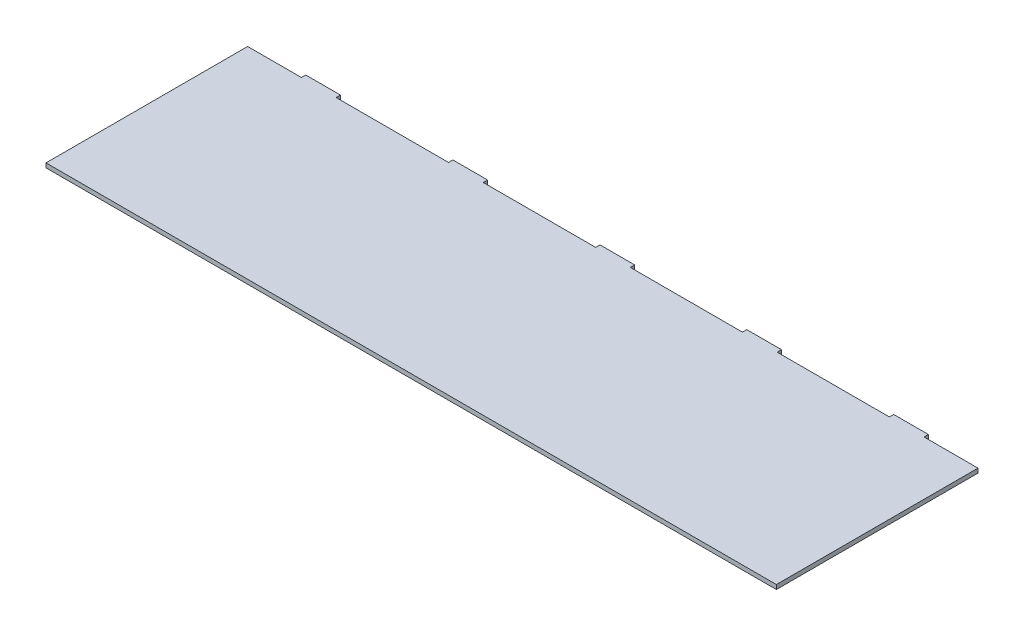
ISO-10303-21;
HEADER;
FILE_DESCRIPTION(('STEP AP214'),'2;1');
FILE_NAME('part.step','',(''),(''),'','','');
FILE_SCHEMA(('AUTOMOTIVE_DESIGN { 1 0 10303 214 1 1 1 1 }'));
ENDSEC;
DATA;
#1=APPLICATION_CONTEXT('core data for automotive mechanical design processes');
#2=APPLICATION_PROTOCOL_DEFINITION('international standard','automotive_design',2000,#1);
#3=PRODUCT_CONTEXT('',#1,'mechanical');
#4=PRODUCT('Part','Part','',(#3));
#5=PRODUCT_RELATED_PRODUCT_CATEGORY('part','',(#4));
#6=PRODUCT_DEFINITION_FORMATION('','',#4);
#7=PRODUCT_DEFINITION_CONTEXT('part definition',#1,'design');
#8=PRODUCT_DEFINITION('design','',#6,#7);
#9=PRODUCT_DEFINITION_SHAPE('','',#8);
#10=(LENGTH_UNIT() NAMED_UNIT(*) SI_UNIT(.MILLI.,.METRE.));
#11=(NAMED_UNIT(*) PLANE_ANGLE_UNIT() SI_UNIT($,.RADIAN.));
#12=(NAMED_UNIT(*) SI_UNIT($,.STERADIAN.) SOLID_ANGLE_UNIT());
#13=UNCERTAINTY_MEASURE_WITH_UNIT(LENGTH_MEASURE(1.E-05),#10,'distance_accuracy_value','');
#14=(GEOMETRIC_REPRESENTATION_CONTEXT(3) GLOBAL_UNCERTAINTY_ASSIGNED_CONTEXT((#13)) GLOBAL_UNIT_ASSIGNED_CONTEXT((#10,
#11,#12)) REPRESENTATION_CONTEXT('',''));
#15=CARTESIAN_POINT('',(0.,0.,0.));
#16=DIRECTION('',(0.,0.,1.));
#17=DIRECTION('',(1.,0.,0.));
#18=AXIS2_PLACEMENT_3D('',#15,#16,#17);
#19=CARTESIAN_POINT('',(0.,3.175,-147.69846));
#20=DIRECTION('',(0.,0.,1.));
#21=DIRECTION('',(1.,0.,0.));
#22=AXIS2_PLACEMENT_3D('',#19,#20,#21);
#23=PLANE('',#22);
#24=DIRECTION('',(0.,1.,0.));
#25=VECTOR('',#24,1.);
#26=CARTESIAN_POINT('',(39.398109833325,1.66533453693773E-12,-147.69846));
#27=LINE('',#26,#25);
#28=CARTESIAN_POINT('',(39.398109833325,1.66533453693773E-12,-147.69846));
#29=VERTEX_POINT('',#28);
#30=CARTESIAN_POINT('',(39.398109833325,3.175,-147.69846));
#31=VERTEX_POINT('',#30);
#32=EDGE_CURVE('E385',#29,#31,#27,.T.);
#33=ORIENTED_EDGE('',*,*,#32,.F.);
#34=DIRECTION('',(-1.,0.,0.));
#35=VECTOR('',#34,1.);
#36=CARTESIAN_POINT('',(0.,0.,-147.69846));
#37=LINE('',#36,#35);
#38=CARTESIAN_POINT('',(0.,0.,-147.69846));
#39=VERTEX_POINT('',#38);
#40=EDGE_CURVE('E220',#29,#39,#37,.T.);
#41=ORIENTED_EDGE('',*,*,#40,.T.);
#42=DIRECTION('',(0.,-1.,0.));
#43=VECTOR('',#42,1.);
#44=CARTESIAN_POINT('',(0.,3.175,-147.69846));
#45=LINE('',#44,#43);
#46=CARTESIAN_POINT('',(0.,3.175,-147.69846));
#47=VERTEX_POINT('',#46);
#48=EDGE_CURVE('E346',#47,#39,#45,.T.);
#49=ORIENTED_EDGE('',*,*,#48,.F.);
#50=DIRECTION('',(-1.,0.,0.));
#51=VECTOR('',#50,1.);
#52=CARTESIAN_POINT('',(0.,3.175,-147.69846));
#53=LINE('',#52,#51);
#54=EDGE_CURVE('E51',#31,#47,#53,.T.);
#55=ORIENTED_EDGE('',*,*,#54,.F.);
#56=EDGE_LOOP('',(#33,#41,#49,#55));
#57=FACE_BOUND('',#56,.T.);
#58=ADVANCED_FACE('F36',(#57),#23,.F.);
#59=DIRECTION('',(0.,-1.,0.));
#60=VECTOR('',#59,1.);
#61=CARTESIAN_POINT('',(64.798109833325,1.66533453693773E-12,-147.69846));
#62=LINE('',#61,#60);
#63=CARTESIAN_POINT('',(64.798109833325,3.175,-147.69846));
#64=VERTEX_POINT('',#63);
#65=CARTESIAN_POINT('',(64.798109833325,0.,-147.69846));
#66=VERTEX_POINT('',#65);
#67=EDGE_CURVE('E59',#64,#66,#62,.T.);
#68=ORIENTED_EDGE('',*,*,#67,.F.);
#69=CARTESIAN_POINT('',(147.188954487785,3.175,-147.69846));
#70=VERTEX_POINT('',#69);
#71=EDGE_CURVE('E416',#70,#64,#53,.T.);
#72=ORIENTED_EDGE('',*,*,#71,.F.);
#73=DIRECTION('',(0.,1.,0.));
#74=VECTOR('',#73,1.);
#75=CARTESIAN_POINT('',(147.188954487785,1.27675647831893E-12,-147.69846));
#76=LINE('',#75,#74);
#77=CARTESIAN_POINT('',(147.188954487785,1.27675647831893E-12,-147.69846));
#78=VERTEX_POINT('',#77);
#79=EDGE_CURVE('E221',#78,#70,#76,.T.);
#80=ORIENTED_EDGE('',*,*,#79,.F.);
#81=EDGE_CURVE('E386',#78,#66,#37,.T.);
#82=ORIENTED_EDGE('',*,*,#81,.T.);
#83=EDGE_LOOP('',(#68,#72,#80,#82));
#84=FACE_BOUND('',#83,.T.);
#85=ADVANCED_FACE('F430',(#84),#23,.F.);
#86=DIRECTION('',(0.,-1.,0.));
#87=VECTOR('',#86,1.);
#88=CARTESIAN_POINT('',(172.588954487785,1.27675647831893E-12,-147.69846));
#89=LINE('',#88,#87);
#90=CARTESIAN_POINT('',(172.588954487785,3.175,-147.69846));
#91=VERTEX_POINT('',#90);
#92=CARTESIAN_POINT('',(172.588954487785,0.,-147.69846));
#93=VERTEX_POINT('',#92);
#94=EDGE_CURVE('E224',#91,#93,#89,.T.);
#95=ORIENTED_EDGE('',*,*,#94,.F.);
#96=CARTESIAN_POINT('',(254.965260383511,3.175,-147.69846));
#97=VERTEX_POINT('',#96);
#98=EDGE_CURVE('E413',#97,#91,#53,.T.);
#99=ORIENTED_EDGE('',*,*,#98,.F.);
#100=DIRECTION('',(0.,1.,0.));
#101=VECTOR('',#100,1.);
#102=CARTESIAN_POINT('',(254.965260383511,6.66133814775094E-13,-147.69846));
#103=LINE('',#102,#101);
#104=CARTESIAN_POINT('',(254.965260383511,6.66133814775094E-13,-147.69846));
#105=VERTEX_POINT('',#104);
#106=EDGE_CURVE('E253',#105,#97,#103,.T.);
#107=ORIENTED_EDGE('',*,*,#106,.F.);
#108=EDGE_CURVE('E387',#105,#93,#37,.T.);
#109=ORIENTED_EDGE('',*,*,#108,.T.);
#110=EDGE_LOOP('',(#95,#99,#107,#109));
#111=FACE_BOUND('',#110,.T.);
#112=ADVANCED_FACE('F442',(#111),#23,.F.);
#113=DIRECTION('',(0.,-1.,0.));
#114=VECTOR('',#113,1.);
#115=CARTESIAN_POINT('',(280.365260383511,6.66133814775094E-13,-147.69846));
#116=LINE('',#115,#114);
#117=CARTESIAN_POINT('',(280.365260383511,3.175,-147.69846));
#118=VERTEX_POINT('',#117);
#119=CARTESIAN_POINT('',(280.365260383511,0.,-147.69846));
#120=VERTEX_POINT('',#119);
#121=EDGE_CURVE('E258',#118,#120,#116,.T.);
#122=ORIENTED_EDGE('',*,*,#121,.F.);
#123=CARTESIAN_POINT('',(362.444029999994,3.175,-147.69846));
#124=VERTEX_POINT('',#123);
#125=EDGE_CURVE('E411',#124,#118,#53,.T.);
#126=ORIENTED_EDGE('',*,*,#125,.F.);
#127=DIRECTION('',(0.,1.,0.));
#128=VECTOR('',#127,1.);
#129=CARTESIAN_POINT('',(362.444029999994,3.88578058618805E-13,-147.69846));
#130=LINE('',#129,#128);
#131=CARTESIAN_POINT('',(362.444029999994,3.88578058618805E-13,-147.69846));
#132=VERTEX_POINT('',#131);
#133=EDGE_CURVE('E280',#132,#124,#130,.T.);
#134=ORIENTED_EDGE('',*,*,#133,.F.);
#135=EDGE_CURVE('E389',#132,#120,#37,.T.);
#136=ORIENTED_EDGE('',*,*,#135,.T.);
#137=EDGE_LOOP('',(#122,#126,#134,#136));
#138=FACE_BOUND('',#137,.T.);
#139=ADVANCED_FACE('F454',(#138),#23,.F.);
#140=DIRECTION('',(0.,-1.,0.));
#141=VECTOR('',#140,1.);
#142=CARTESIAN_POINT('',(387.844029999994,3.88578058618805E-13,-147.69846));
#143=LINE('',#142,#141);
#144=CARTESIAN_POINT('',(387.844029999994,3.175,-147.69846));
#145=VERTEX_POINT('',#144);
#146=CARTESIAN_POINT('',(387.844029999994,0.,-147.69846));
#147=VERTEX_POINT('',#146);
#148=EDGE_CURVE('E285',#145,#147,#143,.T.);
#149=ORIENTED_EDGE('',*,*,#148,.F.);
#150=CARTESIAN_POINT('',(470.071449999994,3.17500000000043,-147.69846));
#151=VERTEX_POINT('',#150);
#152=EDGE_CURVE('E347',#151,#145,#53,.T.);
#153=ORIENTED_EDGE('',*,*,#152,.F.);
#154=DIRECTION('',(0.,1.,0.));
#155=VECTOR('',#154,1.);
#156=CARTESIAN_POINT('',(470.071449999994,0.,-147.69846));
#157=LINE('',#156,#155);
#158=CARTESIAN_POINT('',(470.071449999994,0.,-147.69846));
#159=VERTEX_POINT('',#158);
#160=EDGE_CURVE('E307',#159,#151,#157,.T.);
#161=ORIENTED_EDGE('',*,*,#160,.F.);
#162=EDGE_CURVE('E355',#159,#147,#37,.T.);
#163=ORIENTED_EDGE('',*,*,#162,.T.);
#164=EDGE_LOOP('',(#149,#153,#161,#163));
#165=FACE_BOUND('',#164,.T.);
#166=ADVANCED_FACE('F396',(#165),#23,.F.);
#167=DIRECTION('',(0.,-1.,0.));
#168=VECTOR('',#167,1.);
#169=CARTESIAN_POINT('',(495.471449999994,0.,-147.69846));
#170=LINE('',#169,#168);
#171=CARTESIAN_POINT('',(495.471449999994,3.175,-147.69846));
#172=VERTEX_POINT('',#171);
#173=CARTESIAN_POINT('',(495.471449999994,0.,-147.69846));
#174=VERTEX_POINT('',#173);
#175=EDGE_CURVE('E312',#172,#174,#170,.T.);
#176=ORIENTED_EDGE('',*,*,#175,.F.);
#177=CARTESIAN_POINT('',(534.99766,3.175,-147.69846));
#178=VERTEX_POINT('',#177);
#179=EDGE_CURVE('E343',#178,#172,#53,.T.);
#180=ORIENTED_EDGE('',*,*,#179,.F.);
#181=DIRECTION('',(0.,-1.,0.));
#182=VECTOR('',#181,1.);
#183=CARTESIAN_POINT('',(534.99766,3.175,-147.69846));
#184=LINE('',#183,#182);
#185=CARTESIAN_POINT('',(534.99766,0.,-147.69846));
#186=VERTEX_POINT('',#185);
#187=EDGE_CURVE('E358',#178,#186,#184,.T.);
#188=ORIENTED_EDGE('',*,*,#187,.T.);
#189=EDGE_CURVE('E339',#186,#174,#37,.T.);
#190=ORIENTED_EDGE('',*,*,#189,.T.);
#191=EDGE_LOOP('',(#176,#180,#188,#190));
#192=FACE_BOUND('',#191,.T.);
#193=ADVANCED_FACE('F372',(#192),#23,.F.);
#194=CARTESIAN_POINT('',(0.,3.175,0.));
#195=DIRECTION('',(1.,0.,0.));
#196=DIRECTION('',(0.,0.,-1.));
#197=AXIS2_PLACEMENT_3D('',#194,#195,#196);
#198=PLANE('',#197);
#199=DIRECTION('',(0.,0.,1.));
#200=VECTOR('',#199,1.);
#201=CARTESIAN_POINT('',(0.,0.,0.));
#202=LINE('',#201,#200);
#203=CARTESIAN_POINT('',(0.,0.,0.));
#204=VERTEX_POINT('',#203);
#205=EDGE_CURVE('E334',#39,#204,#202,.T.);
#206=ORIENTED_EDGE('',*,*,#205,.T.);
#207=DIRECTION('',(0.,-1.,0.));
#208=VECTOR('',#207,1.);
#209=CARTESIAN_POINT('',(0.,3.175,0.));
#210=LINE('',#209,#208);
#211=CARTESIAN_POINT('',(0.,3.175,0.));
#212=VERTEX_POINT('',#211);
#213=EDGE_CURVE('E11',#212,#204,#210,.T.);
#214=ORIENTED_EDGE('',*,*,#213,.F.);
#215=DIRECTION('',(0.,0.,1.));
#216=VECTOR('',#215,1.);
#217=CARTESIAN_POINT('',(0.,3.175,0.));
#218=LINE('',#217,#216);
#219=EDGE_CURVE('E335',#47,#212,#218,.T.);
#220=ORIENTED_EDGE('',*,*,#219,.F.);
#221=ORIENTED_EDGE('',*,*,#48,.T.);
#222=EDGE_LOOP('',(#206,#214,#220,#221));
#223=FACE_BOUND('',#222,.T.);
#224=ADVANCED_FACE('F38',(#223),#198,.F.);
#225=CARTESIAN_POINT('',(0.,3.175,0.));
#226=DIRECTION('',(0.,0.,-1.));
#227=DIRECTION('',(-1.,0.,0.));
#228=AXIS2_PLACEMENT_3D('',#225,#226,#227);
#229=PLANE('',#228);
#230=DIRECTION('',(1.,0.,0.));
#231=VECTOR('',#230,1.);
#232=CARTESIAN_POINT('',(0.,0.,0.));
#233=LINE('',#232,#231);
#234=CARTESIAN_POINT('',(534.99766,0.,0.));
#235=VERTEX_POINT('',#234);
#236=EDGE_CURVE('E350',#204,#235,#233,.T.);
#237=ORIENTED_EDGE('',*,*,#236,.T.);
#238=DIRECTION('',(0.,-1.,0.));
#239=VECTOR('',#238,1.);
#240=CARTESIAN_POINT('',(534.99766,3.175,0.));
#241=LINE('',#240,#239);
#242=CARTESIAN_POINT('',(534.99766,3.175,0.));
#243=VERTEX_POINT('',#242);
#244=EDGE_CURVE('E44',#243,#235,#241,.T.);
#245=ORIENTED_EDGE('',*,*,#244,.F.);
#246=DIRECTION('',(1.,0.,0.));
#247=VECTOR('',#246,1.);
#248=CARTESIAN_POINT('',(0.,3.175,0.));
#249=LINE('',#248,#247);
#250=EDGE_CURVE('E338',#212,#243,#249,.T.);
#251=ORIENTED_EDGE('',*,*,#250,.F.);
#252=ORIENTED_EDGE('',*,*,#213,.T.);
#253=EDGE_LOOP('',(#237,#245,#251,#252));
#254=FACE_BOUND('',#253,.T.);
#255=ADVANCED_FACE('F383',(#254),#229,.F.);
#256=CARTESIAN_POINT('',(534.99766,3.175,0.));
#257=DIRECTION('',(-1.,0.,0.));
#258=DIRECTION('',(0.,0.,1.));
#259=AXIS2_PLACEMENT_3D('',#256,#257,#258);
#260=PLANE('',#259);
#261=DIRECTION('',(0.,0.,-1.));
#262=VECTOR('',#261,1.);
#263=CARTESIAN_POINT('',(534.99766,0.,0.));
#264=LINE('',#263,#262);
#265=EDGE_CURVE('E352',#235,#186,#264,.T.);
#266=ORIENTED_EDGE('',*,*,#265,.T.);
#267=ORIENTED_EDGE('',*,*,#187,.F.);
#268=DIRECTION('',(0.,0.,-1.));
#269=VECTOR('',#268,1.);
#270=CARTESIAN_POINT('',(534.99766,3.175,0.));
#271=LINE('',#270,#269);
#272=EDGE_CURVE('E341',#243,#178,#271,.T.);
#273=ORIENTED_EDGE('',*,*,#272,.F.);
#274=ORIENTED_EDGE('',*,*,#244,.T.);
#275=EDGE_LOOP('',(#266,#267,#273,#274));
#276=FACE_BOUND('',#275,.T.);
#277=ADVANCED_FACE('F365',(#276),#260,.F.);
#278=CARTESIAN_POINT('',(0.,3.175,0.));
#279=DIRECTION('',(0.,-1.,0.));
#280=DIRECTION('',(0.,0.,-1.));
#281=AXIS2_PLACEMENT_3D('',#278,#279,#280);
#282=PLANE('',#281);
#283=ORIENTED_EDGE('',*,*,#219,.T.);
#284=ORIENTED_EDGE('',*,*,#250,.T.);
#285=ORIENTED_EDGE('',*,*,#272,.T.);
#286=ORIENTED_EDGE('',*,*,#179,.T.);
#287=DIRECTION('',(0.,0.,1.));
#288=VECTOR('',#287,1.);
#289=CARTESIAN_POINT('',(495.471449999994,3.17500000000043,-150.87346));
#290=LINE('',#289,#288);
#291=CARTESIAN_POINT('',(495.471449999994,3.17500000000043,-150.87346));
#292=VERTEX_POINT('',#291);
#293=EDGE_CURVE('E325',#292,#172,#290,.T.);
#294=ORIENTED_EDGE('',*,*,#293,.F.);
#295=DIRECTION('',(1.,0.,0.));
#296=VECTOR('',#295,1.);
#297=CARTESIAN_POINT('',(495.471449999994,3.17500000000043,-150.87346));
#298=LINE('',#297,#296);
#299=CARTESIAN_POINT('',(470.071449999994,3.17500000000043,-150.87346));
#300=VERTEX_POINT('',#299);
#301=EDGE_CURVE('E314',#300,#292,#298,.T.);
#302=ORIENTED_EDGE('',*,*,#301,.F.);
#303=DIRECTION('',(0.,0.,1.));
#304=VECTOR('',#303,1.);
#305=CARTESIAN_POINT('',(470.071449999994,3.17500000000043,-150.87346));
#306=LINE('',#305,#304);
#307=EDGE_CURVE('E328',#300,#151,#306,.T.);
#308=ORIENTED_EDGE('',*,*,#307,.T.);
#309=ORIENTED_EDGE('',*,*,#152,.T.);
#310=DIRECTION('',(0.,0.,1.));
#311=VECTOR('',#310,1.);
#312=CARTESIAN_POINT('',(387.844029999994,3.17500000000087,-150.87346));
#313=LINE('',#312,#311);
#314=CARTESIAN_POINT('',(387.844029999994,3.17500000000087,-150.87346));
#315=VERTEX_POINT('',#314);
#316=EDGE_CURVE('E298',#315,#145,#313,.T.);
#317=ORIENTED_EDGE('',*,*,#316,.F.);
#318=DIRECTION('',(1.,0.,0.));
#319=VECTOR('',#318,1.);
#320=CARTESIAN_POINT('',(387.844029999994,3.17500000000087,-150.87346));
#321=LINE('',#320,#319);
#322=CARTESIAN_POINT('',(362.444029999994,3.17500000000087,-150.87346));
#323=VERTEX_POINT('',#322);
#324=EDGE_CURVE('E287',#323,#315,#321,.T.);
#325=ORIENTED_EDGE('',*,*,#324,.F.);
#326=DIRECTION('',(0.,0.,1.));
#327=VECTOR('',#326,1.);
#328=CARTESIAN_POINT('',(362.444029999994,3.17500000000087,-150.87346));
#329=LINE('',#328,#327);
#330=EDGE_CURVE('E301',#323,#124,#329,.T.);
#331=ORIENTED_EDGE('',*,*,#330,.T.);
#332=ORIENTED_EDGE('',*,*,#125,.T.);
#333=DIRECTION('',(0.,0.,1.));
#334=VECTOR('',#333,1.);
#335=CARTESIAN_POINT('',(280.365260383511,3.17500000000115,-150.87346));
#336=LINE('',#335,#334);
#337=CARTESIAN_POINT('',(280.365260383511,3.17500000000115,-150.87346));
#338=VERTEX_POINT('',#337);
#339=EDGE_CURVE('E271',#338,#118,#336,.T.);
#340=ORIENTED_EDGE('',*,*,#339,.F.);
#341=DIRECTION('',(1.,0.,0.));
#342=VECTOR('',#341,1.);
#343=CARTESIAN_POINT('',(280.365260383511,3.17500000000115,-150.87346));
#344=LINE('',#343,#342);
#345=CARTESIAN_POINT('',(254.965260383511,3.17500000000115,-150.87346));
#346=VERTEX_POINT('',#345);
#347=EDGE_CURVE('E260',#346,#338,#344,.T.);
#348=ORIENTED_EDGE('',*,*,#347,.F.);
#349=DIRECTION('',(0.,0.,1.));
#350=VECTOR('',#349,1.);
#351=CARTESIAN_POINT('',(254.965260383511,3.17500000000115,-150.87346));
#352=LINE('',#351,#350);
#353=EDGE_CURVE('E274',#346,#97,#352,.T.);
#354=ORIENTED_EDGE('',*,*,#353,.T.);
#355=ORIENTED_EDGE('',*,*,#98,.T.);
#356=DIRECTION('',(0.,0.,1.));
#357=VECTOR('',#356,1.);
#358=CARTESIAN_POINT('',(172.588954487785,3.17500000000132,-150.87346));
#359=LINE('',#358,#357);
#360=CARTESIAN_POINT('',(172.588954487785,3.17500000000132,-150.87346));
#361=VERTEX_POINT('',#360);
#362=EDGE_CURVE('E244',#361,#91,#359,.T.);
#363=ORIENTED_EDGE('',*,*,#362,.F.);
#364=DIRECTION('',(1.,0.,0.));
#365=VECTOR('',#364,1.);
#366=CARTESIAN_POINT('',(172.588954487785,3.17500000000132,-150.87346));
#367=LINE('',#366,#365);
#368=CARTESIAN_POINT('',(147.188954487785,3.17500000000132,-150.87346));
#369=VERTEX_POINT('',#368);
#370=EDGE_CURVE('E235',#369,#361,#367,.T.);
#371=ORIENTED_EDGE('',*,*,#370,.F.);
#372=DIRECTION('',(0.,0.,1.));
#373=VECTOR('',#372,1.);
#374=CARTESIAN_POINT('',(147.188954487785,3.17500000000132,-150.87346));
#375=LINE('',#374,#373);
#376=EDGE_CURVE('E247',#369,#70,#375,.T.);
#377=ORIENTED_EDGE('',*,*,#376,.T.);
#378=ORIENTED_EDGE('',*,*,#71,.T.);
#379=DIRECTION('',(0.,0.,1.));
#380=VECTOR('',#379,1.);
#381=CARTESIAN_POINT('',(64.798109833325,3.1750000000017,-150.87346));
#382=LINE('',#381,#380);
#383=CARTESIAN_POINT('',(64.798109833325,3.1750000000017,-150.87346));
#384=VERTEX_POINT('',#383);
#385=EDGE_CURVE('E226',#384,#64,#382,.T.);
#386=ORIENTED_EDGE('',*,*,#385,.F.);
#387=DIRECTION('',(1.,0.,0.));
#388=VECTOR('',#387,1.);
#389=CARTESIAN_POINT('',(64.798109833325,3.1750000000017,-150.87346));
#390=LINE('',#389,#388);
#391=CARTESIAN_POINT('',(39.398109833325,3.1750000000017,-150.87346));
#392=VERTEX_POINT('',#391);
#393=EDGE_CURVE('E207',#392,#384,#390,.T.);
#394=ORIENTED_EDGE('',*,*,#393,.F.);
#395=DIRECTION('',(0.,0.,1.));
#396=VECTOR('',#395,1.);
#397=CARTESIAN_POINT('',(39.398109833325,3.1750000000017,-150.87346));
#398=LINE('',#397,#396);
#399=EDGE_CURVE('E204',#392,#31,#398,.T.);
#400=ORIENTED_EDGE('',*,*,#399,.T.);
#401=ORIENTED_EDGE('',*,*,#54,.T.);
#402=EDGE_LOOP('',(#283,#284,#285,#286,#294,#302,#308,#309,#317,#325,#331,#332,#340,#348,#354,
#355,#363,#371,#377,#378,#386,#394,#400,#401));
#403=FACE_BOUND('',#402,.T.);
#404=ADVANCED_FACE('F380',(#403),#282,.F.);
#405=CARTESIAN_POINT('',(0.,0.,0.));
#406=DIRECTION('',(0.,-1.,0.));
#407=DIRECTION('',(0.,0.,-1.));
#408=AXIS2_PLACEMENT_3D('',#405,#406,#407);
#409=PLANE('',#408);
#410=ORIENTED_EDGE('',*,*,#205,.F.);
#411=ORIENTED_EDGE('',*,*,#40,.F.);
#412=DIRECTION('',(0.,0.,1.));
#413=VECTOR('',#412,1.);
#414=CARTESIAN_POINT('',(39.398109833325,1.66533453693773E-12,-150.87346));
#415=LINE('',#414,#413);
#416=CARTESIAN_POINT('',(39.398109833325,1.66533453693773E-12,-150.87346));
#417=VERTEX_POINT('',#416);
#418=EDGE_CURVE('E202',#417,#29,#415,.T.);
#419=ORIENTED_EDGE('',*,*,#418,.F.);
#420=DIRECTION('',(-1.,0.,0.));
#421=VECTOR('',#420,1.);
#422=CARTESIAN_POINT('',(64.798109833325,1.66533453693773E-12,-150.87346));
#423=LINE('',#422,#421);
#424=CARTESIAN_POINT('',(64.798109833325,1.66533453693773E-12,-150.87346));
#425=VERTEX_POINT('',#424);
#426=EDGE_CURVE('E208',#425,#417,#423,.T.);
#427=ORIENTED_EDGE('',*,*,#426,.F.);
#428=DIRECTION('',(0.,0.,1.));
#429=VECTOR('',#428,1.);
#430=CARTESIAN_POINT('',(64.798109833325,1.66533453693773E-12,-150.87346));
#431=LINE('',#430,#429);
#432=EDGE_CURVE('E421',#425,#66,#431,.T.);
#433=ORIENTED_EDGE('',*,*,#432,.T.);
#434=ORIENTED_EDGE('',*,*,#81,.F.);
#435=DIRECTION('',(0.,0.,1.));
#436=VECTOR('',#435,1.);
#437=CARTESIAN_POINT('',(147.188954487785,1.27675647831893E-12,-150.87346));
#438=LINE('',#437,#436);
#439=CARTESIAN_POINT('',(147.188954487785,1.27675647831893E-12,-150.87346));
#440=VERTEX_POINT('',#439);
#441=EDGE_CURVE('E250',#440,#78,#438,.T.);
#442=ORIENTED_EDGE('',*,*,#441,.F.);
#443=DIRECTION('',(-1.,0.,0.));
#444=VECTOR('',#443,1.);
#445=CARTESIAN_POINT('',(172.588954487785,1.27675647831893E-12,-150.87346));
#446=LINE('',#445,#444);
#447=CARTESIAN_POINT('',(172.588954487785,1.27675647831893E-12,-150.87346));
#448=VERTEX_POINT('',#447);
#449=EDGE_CURVE('E230',#448,#440,#446,.T.);
#450=ORIENTED_EDGE('',*,*,#449,.F.);
#451=DIRECTION('',(0.,0.,1.));
#452=VECTOR('',#451,1.);
#453=CARTESIAN_POINT('',(172.588954487785,1.27675647831893E-12,-150.87346));
#454=LINE('',#453,#452);
#455=EDGE_CURVE('E238',#448,#93,#454,.T.);
#456=ORIENTED_EDGE('',*,*,#455,.T.);
#457=ORIENTED_EDGE('',*,*,#108,.F.);
#458=DIRECTION('',(0.,0.,1.));
#459=VECTOR('',#458,1.);
#460=CARTESIAN_POINT('',(254.965260383511,6.66133814775094E-13,-150.87346));
#461=LINE('',#460,#459);
#462=CARTESIAN_POINT('',(254.965260383511,6.66133814775094E-13,-150.87346));
#463=VERTEX_POINT('',#462);
#464=EDGE_CURVE('E277',#463,#105,#461,.T.);
#465=ORIENTED_EDGE('',*,*,#464,.F.);
#466=DIRECTION('',(-1.,0.,0.));
#467=VECTOR('',#466,1.);
#468=CARTESIAN_POINT('',(280.365260383511,6.66133814775094E-13,-150.87346));
#469=LINE('',#468,#467);
#470=CARTESIAN_POINT('',(280.365260383511,6.66133814775094E-13,-150.87346));
#471=VERTEX_POINT('',#470);
#472=EDGE_CURVE('E254',#471,#463,#469,.T.);
#473=ORIENTED_EDGE('',*,*,#472,.F.);
#474=DIRECTION('',(0.,0.,1.));
#475=VECTOR('',#474,1.);
#476=CARTESIAN_POINT('',(280.365260383511,6.66133814775094E-13,-150.87346));
#477=LINE('',#476,#475);
#478=EDGE_CURVE('E264',#471,#120,#477,.T.);
#479=ORIENTED_EDGE('',*,*,#478,.T.);
#480=ORIENTED_EDGE('',*,*,#135,.F.);
#481=DIRECTION('',(0.,0.,1.));
#482=VECTOR('',#481,1.);
#483=CARTESIAN_POINT('',(362.444029999994,3.88578058618805E-13,-150.87346));
#484=LINE('',#483,#482);
#485=CARTESIAN_POINT('',(362.444029999994,3.88578058618805E-13,-150.87346));
#486=VERTEX_POINT('',#485);
#487=EDGE_CURVE('E304',#486,#132,#484,.T.);
#488=ORIENTED_EDGE('',*,*,#487,.F.);
#489=DIRECTION('',(-1.,0.,0.));
#490=VECTOR('',#489,1.);
#491=CARTESIAN_POINT('',(387.844029999994,3.88578058618805E-13,-150.87346));
#492=LINE('',#491,#490);
#493=CARTESIAN_POINT('',(387.844029999994,3.88578058618805E-13,-150.87346));
#494=VERTEX_POINT('',#493);
#495=EDGE_CURVE('E281',#494,#486,#492,.T.);
#496=ORIENTED_EDGE('',*,*,#495,.F.);
#497=DIRECTION('',(0.,0.,1.));
#498=VECTOR('',#497,1.);
#499=CARTESIAN_POINT('',(387.844029999994,3.88578058618805E-13,-150.87346));
#500=LINE('',#499,#498);
#501=EDGE_CURVE('E291',#494,#147,#500,.T.);
#502=ORIENTED_EDGE('',*,*,#501,.T.);
#503=ORIENTED_EDGE('',*,*,#162,.F.);
#504=DIRECTION('',(0.,0.,1.));
#505=VECTOR('',#504,1.);
#506=CARTESIAN_POINT('',(470.071449999994,0.,-150.87346));
#507=LINE('',#506,#505);
#508=CARTESIAN_POINT('',(470.071449999994,0.,-150.87346));
#509=VERTEX_POINT('',#508);
#510=EDGE_CURVE('E331',#509,#159,#507,.T.);
#511=ORIENTED_EDGE('',*,*,#510,.F.);
#512=DIRECTION('',(-1.,0.,0.));
#513=VECTOR('',#512,1.);
#514=CARTESIAN_POINT('',(495.471449999994,0.,-150.87346));
#515=LINE('',#514,#513);
#516=CARTESIAN_POINT('',(495.471449999994,0.,-150.87346));
#517=VERTEX_POINT('',#516);
#518=EDGE_CURVE('E308',#517,#509,#515,.T.);
#519=ORIENTED_EDGE('',*,*,#518,.F.);
#520=DIRECTION('',(0.,0.,1.));
#521=VECTOR('',#520,1.);
#522=CARTESIAN_POINT('',(495.471449999994,0.,-150.87346));
#523=LINE('',#522,#521);
#524=EDGE_CURVE('E318',#517,#174,#523,.T.);
#525=ORIENTED_EDGE('',*,*,#524,.T.);
#526=ORIENTED_EDGE('',*,*,#189,.F.);
#527=ORIENTED_EDGE('',*,*,#265,.F.);
#528=ORIENTED_EDGE('',*,*,#236,.F.);
#529=EDGE_LOOP('',(#410,#411,#419,#427,#433,#434,#442,#450,#456,#457,#465,#473,#479,#480,#488,
#496,#502,#503,#511,#519,#525,#526,#527,#528));
#530=FACE_BOUND('',#529,.T.);
#531=ADVANCED_FACE('F219',(#530),#409,.T.);
#532=CARTESIAN_POINT('',(470.071449999994,0.,-150.87346));
#533=DIRECTION('',(1.,0.,0.));
#534=DIRECTION('',(0.,0.,-1.));
#535=AXIS2_PLACEMENT_3D('',#532,#533,#534);
#536=PLANE('',#535);
#537=ORIENTED_EDGE('',*,*,#160,.T.);
#538=ORIENTED_EDGE('',*,*,#307,.F.);
#539=DIRECTION('',(0.,1.,0.));
#540=VECTOR('',#539,1.);
#541=CARTESIAN_POINT('',(470.071449999994,0.,-150.87346));
#542=LINE('',#541,#540);
#543=EDGE_CURVE('E311',#509,#300,#542,.T.);
#544=ORIENTED_EDGE('',*,*,#543,.F.);
#545=ORIENTED_EDGE('',*,*,#510,.T.);
#546=EDGE_LOOP('',(#537,#538,#544,#545));
#547=FACE_BOUND('',#546,.T.);
#548=ADVANCED_FACE('F531',(#547),#536,.F.);
#549=CARTESIAN_POINT('',(495.471449999994,0.,-150.87346));
#550=DIRECTION('',(-1.,0.,0.));
#551=DIRECTION('',(0.,0.,1.));
#552=AXIS2_PLACEMENT_3D('',#549,#550,#551);
#553=PLANE('',#552);
#554=ORIENTED_EDGE('',*,*,#175,.T.);
#555=ORIENTED_EDGE('',*,*,#524,.F.);
#556=DIRECTION('',(0.,-1.,0.));
#557=VECTOR('',#556,1.);
#558=CARTESIAN_POINT('',(495.471449999994,0.,-150.87346));
#559=LINE('',#558,#557);
#560=EDGE_CURVE('E316',#292,#517,#559,.T.);
#561=ORIENTED_EDGE('',*,*,#560,.F.);
#562=ORIENTED_EDGE('',*,*,#293,.T.);
#563=EDGE_LOOP('',(#554,#555,#561,#562));
#564=FACE_BOUND('',#563,.T.);
#565=ADVANCED_FACE('F375',(#564),#553,.F.);
#566=CARTESIAN_POINT('',(0.,0.,-150.87346));
#567=DIRECTION('',(0.,0.,-1.));
#568=DIRECTION('',(-1.,0.,0.));
#569=AXIS2_PLACEMENT_3D('',#566,#567,#568);
#570=PLANE('',#569);
#571=ORIENTED_EDGE('',*,*,#518,.T.);
#572=ORIENTED_EDGE('',*,*,#543,.T.);
#573=ORIENTED_EDGE('',*,*,#301,.T.);
#574=ORIENTED_EDGE('',*,*,#560,.T.);
#575=EDGE_LOOP('',(#571,#572,#573,#574));
#576=FACE_BOUND('',#575,.T.);
#577=ADVANCED_FACE('F458',(#576),#570,.T.);
#578=CARTESIAN_POINT('',(362.444029999994,3.88578058618805E-13,-150.87346));
#579=DIRECTION('',(1.,0.,0.));
#580=DIRECTION('',(0.,0.,-1.));
#581=AXIS2_PLACEMENT_3D('',#578,#579,#580);
#582=PLANE('',#581);
#583=ORIENTED_EDGE('',*,*,#133,.T.);
#584=ORIENTED_EDGE('',*,*,#330,.F.);
#585=DIRECTION('',(0.,1.,0.));
#586=VECTOR('',#585,1.);
#587=CARTESIAN_POINT('',(362.444029999994,3.88578058618805E-13,-150.87346));
#588=LINE('',#587,#586);
#589=EDGE_CURVE('E284',#486,#323,#588,.T.);
#590=ORIENTED_EDGE('',*,*,#589,.F.);
#591=ORIENTED_EDGE('',*,*,#487,.T.);
#592=EDGE_LOOP('',(#583,#584,#590,#591));
#593=FACE_BOUND('',#592,.T.);
#594=ADVANCED_FACE('F456',(#593),#582,.F.);
#595=CARTESIAN_POINT('',(387.844029999994,3.88578058618805E-13,-150.87346));
#596=DIRECTION('',(-1.,0.,0.));
#597=DIRECTION('',(0.,0.,1.));
#598=AXIS2_PLACEMENT_3D('',#595,#596,#597);
#599=PLANE('',#598);
#600=ORIENTED_EDGE('',*,*,#148,.T.);
#601=ORIENTED_EDGE('',*,*,#501,.F.);
#602=DIRECTION('',(0.,-1.,0.));
#603=VECTOR('',#602,1.);
#604=CARTESIAN_POINT('',(387.844029999994,3.88578058618805E-13,-150.87346));
#605=LINE('',#604,#603);
#606=EDGE_CURVE('E289',#315,#494,#605,.T.);
#607=ORIENTED_EDGE('',*,*,#606,.F.);
#608=ORIENTED_EDGE('',*,*,#316,.T.);
#609=EDGE_LOOP('',(#600,#601,#607,#608));
#610=FACE_BOUND('',#609,.T.);
#611=ADVANCED_FACE('F401',(#610),#599,.F.);
#612=CARTESIAN_POINT('',(0.,0.,-150.87346));
#613=DIRECTION('',(0.,0.,-1.));
#614=DIRECTION('',(-1.,0.,0.));
#615=AXIS2_PLACEMENT_3D('',#612,#613,#614);
#616=PLANE('',#615);
#617=ORIENTED_EDGE('',*,*,#495,.T.);
#618=ORIENTED_EDGE('',*,*,#589,.T.);
#619=ORIENTED_EDGE('',*,*,#324,.T.);
#620=ORIENTED_EDGE('',*,*,#606,.T.);
#621=EDGE_LOOP('',(#617,#618,#619,#620));
#622=FACE_BOUND('',#621,.T.);
#623=ADVANCED_FACE('F407',(#622),#616,.T.);
#624=CARTESIAN_POINT('',(254.965260383511,6.66133814775094E-13,-150.87346));
#625=DIRECTION('',(1.,0.,0.));
#626=DIRECTION('',(0.,0.,-1.));
#627=AXIS2_PLACEMENT_3D('',#624,#625,#626);
#628=PLANE('',#627);
#629=ORIENTED_EDGE('',*,*,#106,.T.);
#630=ORIENTED_EDGE('',*,*,#353,.F.);
#631=DIRECTION('',(0.,1.,0.));
#632=VECTOR('',#631,1.);
#633=CARTESIAN_POINT('',(254.965260383511,6.66133814775094E-13,-150.87346));
#634=LINE('',#633,#632);
#635=EDGE_CURVE('E257',#463,#346,#634,.T.);
#636=ORIENTED_EDGE('',*,*,#635,.F.);
#637=ORIENTED_EDGE('',*,*,#464,.T.);
#638=EDGE_LOOP('',(#629,#630,#636,#637));
#639=FACE_BOUND('',#638,.T.);
#640=ADVANCED_FACE('F445',(#639),#628,.F.);
#641=CARTESIAN_POINT('',(280.365260383511,6.66133814775094E-13,-150.87346));
#642=DIRECTION('',(-1.,0.,0.));
#643=DIRECTION('',(0.,0.,1.));
#644=AXIS2_PLACEMENT_3D('',#641,#642,#643);
#645=PLANE('',#644);
#646=ORIENTED_EDGE('',*,*,#121,.T.);
#647=ORIENTED_EDGE('',*,*,#478,.F.);
#648=DIRECTION('',(0.,-1.,0.));
#649=VECTOR('',#648,1.);
#650=CARTESIAN_POINT('',(280.365260383511,6.66133814775094E-13,-150.87346));
#651=LINE('',#650,#649);
#652=EDGE_CURVE('E262',#338,#471,#651,.T.);
#653=ORIENTED_EDGE('',*,*,#652,.F.);
#654=ORIENTED_EDGE('',*,*,#339,.T.);
#655=EDGE_LOOP('',(#646,#647,#653,#654));
#656=FACE_BOUND('',#655,.T.);
#657=ADVANCED_FACE('F453',(#656),#645,.F.);
#658=CARTESIAN_POINT('',(0.,0.,-150.87346));
#659=DIRECTION('',(0.,0.,-1.));
#660=DIRECTION('',(-1.,0.,0.));
#661=AXIS2_PLACEMENT_3D('',#658,#659,#660);
#662=PLANE('',#661);
#663=ORIENTED_EDGE('',*,*,#472,.T.);
#664=ORIENTED_EDGE('',*,*,#635,.T.);
#665=ORIENTED_EDGE('',*,*,#347,.T.);
#666=ORIENTED_EDGE('',*,*,#652,.T.);
#667=EDGE_LOOP('',(#663,#664,#665,#666));
#668=FACE_BOUND('',#667,.T.);
#669=ADVANCED_FACE('F449',(#668),#662,.T.);
#670=CARTESIAN_POINT('',(147.188954487785,1.27675647831893E-12,-150.87346));
#671=DIRECTION('',(1.,0.,0.));
#672=DIRECTION('',(0.,0.,-1.));
#673=AXIS2_PLACEMENT_3D('',#670,#671,#672);
#674=PLANE('',#673);
#675=ORIENTED_EDGE('',*,*,#79,.T.);
#676=ORIENTED_EDGE('',*,*,#376,.F.);
#677=DIRECTION('',(0.,1.,0.));
#678=VECTOR('',#677,1.);
#679=CARTESIAN_POINT('',(147.188954487785,1.27675647831893E-12,-150.87346));
#680=LINE('',#679,#678);
#681=EDGE_CURVE('E233',#440,#369,#680,.T.);
#682=ORIENTED_EDGE('',*,*,#681,.F.);
#683=ORIENTED_EDGE('',*,*,#441,.T.);
#684=EDGE_LOOP('',(#675,#676,#682,#683));
#685=FACE_BOUND('',#684,.T.);
#686=ADVANCED_FACE('F433',(#685),#674,.F.);
#687=CARTESIAN_POINT('',(172.588954487785,1.27675647831893E-12,-150.87346));
#688=DIRECTION('',(-1.,0.,0.));
#689=DIRECTION('',(0.,0.,1.));
#690=AXIS2_PLACEMENT_3D('',#687,#688,#689);
#691=PLANE('',#690);
#692=ORIENTED_EDGE('',*,*,#94,.T.);
#693=ORIENTED_EDGE('',*,*,#455,.F.);
#694=DIRECTION('',(0.,-1.,0.));
#695=VECTOR('',#694,1.);
#696=CARTESIAN_POINT('',(172.588954487785,1.27675647831893E-12,-150.87346));
#697=LINE('',#696,#695);
#698=EDGE_CURVE('E237',#361,#448,#697,.T.);
#699=ORIENTED_EDGE('',*,*,#698,.F.);
#700=ORIENTED_EDGE('',*,*,#362,.T.);
#701=EDGE_LOOP('',(#692,#693,#699,#700));
#702=FACE_BOUND('',#701,.T.);
#703=ADVANCED_FACE('F441',(#702),#691,.F.);
#704=CARTESIAN_POINT('',(0.,0.,-150.87346));
#705=DIRECTION('',(0.,0.,-1.));
#706=DIRECTION('',(-1.,0.,0.));
#707=AXIS2_PLACEMENT_3D('',#704,#705,#706);
#708=PLANE('',#707);
#709=ORIENTED_EDGE('',*,*,#449,.T.);
#710=ORIENTED_EDGE('',*,*,#681,.T.);
#711=ORIENTED_EDGE('',*,*,#370,.T.);
#712=ORIENTED_EDGE('',*,*,#698,.T.);
#713=EDGE_LOOP('',(#709,#710,#711,#712));
#714=FACE_BOUND('',#713,.T.);
#715=ADVANCED_FACE('F436',(#714),#708,.T.);
#716=CARTESIAN_POINT('',(39.398109833325,1.66533453693773E-12,-150.87346));
#717=DIRECTION('',(1.,0.,0.));
#718=DIRECTION('',(0.,0.,-1.));
#719=AXIS2_PLACEMENT_3D('',#716,#717,#718);
#720=PLANE('',#719);
#721=ORIENTED_EDGE('',*,*,#32,.T.);
#722=ORIENTED_EDGE('',*,*,#399,.F.);
#723=DIRECTION('',(0.,1.,0.));
#724=VECTOR('',#723,1.);
#725=CARTESIAN_POINT('',(39.398109833325,1.66533453693773E-12,-150.87346));
#726=LINE('',#725,#724);
#727=EDGE_CURVE('E198',#417,#392,#726,.T.);
#728=ORIENTED_EDGE('',*,*,#727,.F.);
#729=ORIENTED_EDGE('',*,*,#418,.T.);
#730=EDGE_LOOP('',(#721,#722,#728,#729));
#731=FACE_BOUND('',#730,.T.);
#732=ADVANCED_FACE('F200',(#731),#720,.F.);
#733=CARTESIAN_POINT('',(64.798109833325,1.66533453693773E-12,-150.87346));
#734=DIRECTION('',(-1.,0.,0.));
#735=DIRECTION('',(0.,0.,1.));
#736=AXIS2_PLACEMENT_3D('',#733,#734,#735);
#737=PLANE('',#736);
#738=ORIENTED_EDGE('',*,*,#67,.T.);
#739=ORIENTED_EDGE('',*,*,#432,.F.);
#740=DIRECTION('',(0.,-1.,0.));
#741=VECTOR('',#740,1.);
#742=CARTESIAN_POINT('',(64.798109833325,1.66533453693773E-12,-150.87346));
#743=LINE('',#742,#741);
#744=EDGE_CURVE('E213',#384,#425,#743,.T.);
#745=ORIENTED_EDGE('',*,*,#744,.F.);
#746=ORIENTED_EDGE('',*,*,#385,.T.);
#747=EDGE_LOOP('',(#738,#739,#745,#746));
#748=FACE_BOUND('',#747,.T.);
#749=ADVANCED_FACE('F427',(#748),#737,.F.);
#750=CARTESIAN_POINT('',(0.,0.,-150.87346));
#751=DIRECTION('',(0.,0.,-1.));
#752=DIRECTION('',(-1.,0.,0.));
#753=AXIS2_PLACEMENT_3D('',#750,#751,#752);
#754=PLANE('',#753);
#755=ORIENTED_EDGE('',*,*,#426,.T.);
#756=ORIENTED_EDGE('',*,*,#727,.T.);
#757=ORIENTED_EDGE('',*,*,#393,.T.);
#758=ORIENTED_EDGE('',*,*,#744,.T.);
#759=EDGE_LOOP('',(#755,#756,#757,#758));
#760=FACE_BOUND('',#759,.T.);
#761=ADVANCED_FACE('F211',(#760),#754,.T.);
#762=CLOSED_SHELL('',(#58,#85,#112,#139,#166,#193,#224,#255,#277,#404,#531,#548,#565,#577,#594,
#611,#623,#640,#657,#669,#686,#703,#715,#732,#749,#761));
#763=MANIFOLD_SOLID_BREP('B2',#762);
#764=ADVANCED_BREP_SHAPE_REPRESENTATION('',(#18,#763),#14);
#765=SHAPE_DEFINITION_REPRESENTATION(#9,#764);
ENDSEC;
END-ISO-10303-21;
